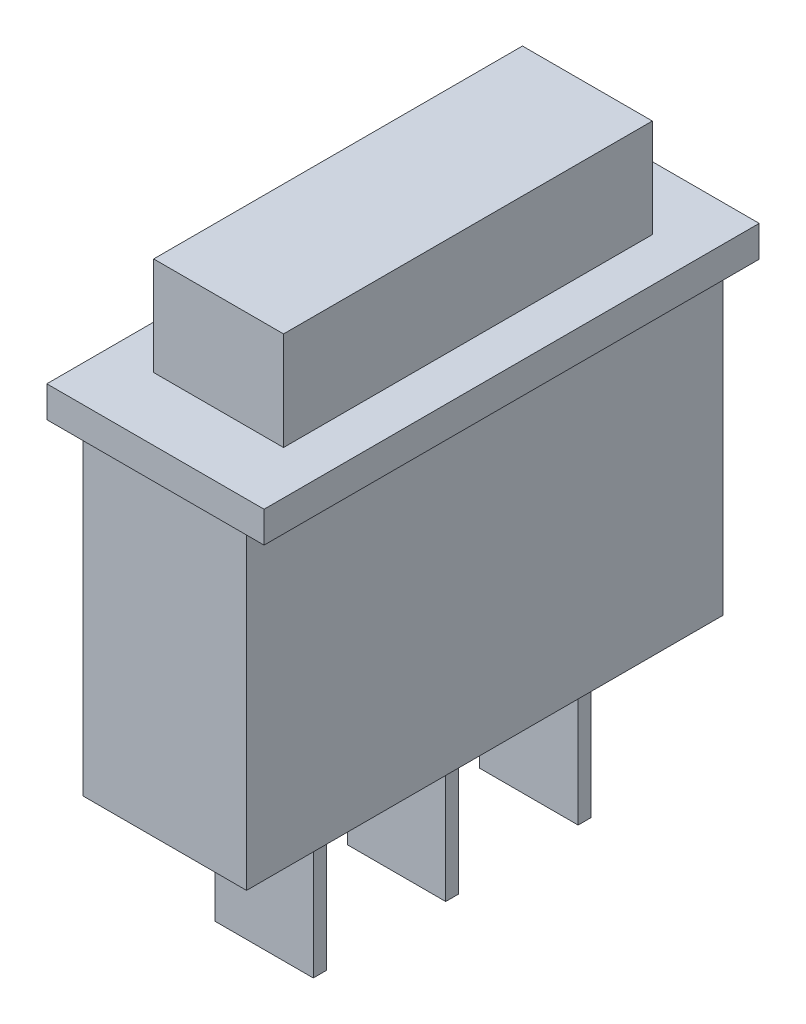
ISO-10303-21;
HEADER;
FILE_DESCRIPTION(('STEP AP214'),'2;1');
FILE_NAME('part.step','',(''),(''),'','','');
FILE_SCHEMA(('AUTOMOTIVE_DESIGN { 1 0 10303 214 1 1 1 1 }'));
ENDSEC;
DATA;
#1=APPLICATION_CONTEXT('core data for automotive mechanical design processes');
#2=APPLICATION_PROTOCOL_DEFINITION('international standard','automotive_design',2000,#1);
#3=PRODUCT_CONTEXT('',#1,'mechanical');
#4=PRODUCT('Part','Part','',(#3));
#5=PRODUCT_RELATED_PRODUCT_CATEGORY('part','',(#4));
#6=PRODUCT_DEFINITION_FORMATION('','',#4);
#7=PRODUCT_DEFINITION_CONTEXT('part definition',#1,'design');
#8=PRODUCT_DEFINITION('design','',#6,#7);
#9=PRODUCT_DEFINITION_SHAPE('','',#8);
#10=(LENGTH_UNIT() NAMED_UNIT(*) SI_UNIT(.MILLI.,.METRE.));
#11=(NAMED_UNIT(*) PLANE_ANGLE_UNIT() SI_UNIT($,.RADIAN.));
#12=(NAMED_UNIT(*) SI_UNIT($,.STERADIAN.) SOLID_ANGLE_UNIT());
#13=UNCERTAINTY_MEASURE_WITH_UNIT(LENGTH_MEASURE(1.E-05),#10,'distance_accuracy_value','');
#14=(GEOMETRIC_REPRESENTATION_CONTEXT(3) GLOBAL_UNCERTAINTY_ASSIGNED_CONTEXT((#13)) GLOBAL_UNIT_ASSIGNED_CONTEXT((#10,
#11,#12)) REPRESENTATION_CONTEXT('',''));
#15=CARTESIAN_POINT('',(0.,0.,0.));
#16=DIRECTION('',(0.,0.,1.));
#17=DIRECTION('',(1.,0.,0.));
#18=AXIS2_PLACEMENT_3D('',#15,#16,#17);
#19=CARTESIAN_POINT('',(0.,0.,0.));
#20=DIRECTION('',(0.,-1.,0.));
#21=DIRECTION('',(0.,0.,-1.));
#22=AXIS2_PLACEMENT_3D('',#19,#20,#21);
#23=PLANE('',#22);
#24=DIRECTION('',(0.,0.,1.));
#25=VECTOR('',#24,1.);
#26=CARTESIAN_POINT('',(0.,0.,0.));
#27=LINE('',#26,#25);
#28=CARTESIAN_POINT('',(0.,0.,-30.734));
#29=VERTEX_POINT('',#28);
#30=CARTESIAN_POINT('',(0.,0.,0.));
#31=VERTEX_POINT('',#30);
#32=EDGE_CURVE('E341',#29,#31,#27,.T.);
#33=ORIENTED_EDGE('',*,*,#32,.F.);
#34=DIRECTION('',(-1.,0.,0.));
#35=VECTOR('',#34,1.);
#36=CARTESIAN_POINT('',(0.,0.,-30.734));
#37=LINE('',#36,#35);
#38=CARTESIAN_POINT('',(10.541,0.,-30.734));
#39=VERTEX_POINT('',#38);
#40=EDGE_CURVE('E346',#39,#29,#37,.T.);
#41=ORIENTED_EDGE('',*,*,#40,.F.);
#42=DIRECTION('',(0.,0.,-1.));
#43=VECTOR('',#42,1.);
#44=CARTESIAN_POINT('',(10.541,0.,0.));
#45=LINE('',#44,#43);
#46=CARTESIAN_POINT('',(10.541,0.,0.));
#47=VERTEX_POINT('',#46);
#48=EDGE_CURVE('E360',#47,#39,#45,.T.);
#49=ORIENTED_EDGE('',*,*,#48,.F.);
#50=DIRECTION('',(1.,0.,0.));
#51=VECTOR('',#50,1.);
#52=CARTESIAN_POINT('',(0.,0.,0.));
#53=LINE('',#52,#51);
#54=EDGE_CURVE('E358',#31,#47,#53,.T.);
#55=ORIENTED_EDGE('',*,*,#54,.F.);
#56=EDGE_LOOP('',(#33,#41,#49,#55));
#57=FACE_BOUND('',#56,.T.);
#58=DIRECTION('',(1.,0.,0.));
#59=VECTOR('',#58,1.);
#60=CARTESIAN_POINT('',(8.44550000000001,0.,-24.3323307977406));
#61=LINE('',#60,#59);
#62=CARTESIAN_POINT('',(2.09550000000001,0.,-24.3323307977406));
#63=VERTEX_POINT('',#62);
#64=CARTESIAN_POINT('',(8.44550000000001,0.,-24.3323307977406));
#65=VERTEX_POINT('',#64);
#66=EDGE_CURVE('E267',#63,#65,#61,.T.);
#67=ORIENTED_EDGE('',*,*,#66,.F.);
#68=DIRECTION('',(0.,0.,-1.));
#69=VECTOR('',#68,1.);
#70=CARTESIAN_POINT('',(2.09550000000001,0.,-23.4941307977406));
#71=LINE('',#70,#69);
#72=CARTESIAN_POINT('',(2.09550000000001,0.,-23.4941307977406));
#73=VERTEX_POINT('',#72);
#74=EDGE_CURVE('E253',#73,#63,#71,.T.);
#75=ORIENTED_EDGE('',*,*,#74,.F.);
#76=DIRECTION('',(-1.,0.,0.));
#77=VECTOR('',#76,1.);
#78=CARTESIAN_POINT('',(8.44550000000001,0.,-23.4941307977406));
#79=LINE('',#78,#77);
#80=CARTESIAN_POINT('',(8.44550000000001,0.,-23.4941307977406));
#81=VERTEX_POINT('',#80);
#82=EDGE_CURVE('E258',#81,#73,#79,.T.);
#83=ORIENTED_EDGE('',*,*,#82,.F.);
#84=DIRECTION('',(0.,0.,1.));
#85=VECTOR('',#84,1.);
#86=CARTESIAN_POINT('',(8.44550000000001,0.,-23.4941307977406));
#87=LINE('',#86,#85);
#88=EDGE_CURVE('E269',#65,#81,#87,.T.);
#89=ORIENTED_EDGE('',*,*,#88,.F.);
#90=EDGE_LOOP('',(#67,#75,#83,#89));
#91=FACE_BOUND('',#90,.T.);
#92=DIRECTION('',(-1.,0.,0.));
#93=VECTOR('',#92,1.);
#94=CARTESIAN_POINT('',(2.0955,0.,-14.9479));
#95=LINE('',#94,#93);
#96=CARTESIAN_POINT('',(8.4455,0.,-14.9479));
#97=VERTEX_POINT('',#96);
#98=CARTESIAN_POINT('',(2.0955,0.,-14.9479));
#99=VERTEX_POINT('',#98);
#100=EDGE_CURVE('E225',#97,#99,#95,.T.);
#101=ORIENTED_EDGE('',*,*,#100,.F.);
#102=DIRECTION('',(0.,0.,1.));
#103=VECTOR('',#102,1.);
#104=CARTESIAN_POINT('',(8.4455,0.,-15.7861));
#105=LINE('',#104,#103);
#106=CARTESIAN_POINT('',(8.4455,0.,-15.7861));
#107=VERTEX_POINT('',#106);
#108=EDGE_CURVE('E222',#107,#97,#105,.T.);
#109=ORIENTED_EDGE('',*,*,#108,.F.);
#110=DIRECTION('',(1.,0.,0.));
#111=VECTOR('',#110,1.);
#112=CARTESIAN_POINT('',(2.0955,0.,-15.7861));
#113=LINE('',#112,#111);
#114=CARTESIAN_POINT('',(2.0955,0.,-15.7861));
#115=VERTEX_POINT('',#114);
#116=EDGE_CURVE('E234',#115,#107,#113,.T.);
#117=ORIENTED_EDGE('',*,*,#116,.F.);
#118=DIRECTION('',(0.,0.,-1.));
#119=VECTOR('',#118,1.);
#120=CARTESIAN_POINT('',(2.0955,0.,-15.7861));
#121=LINE('',#120,#119);
#122=EDGE_CURVE('E242',#99,#115,#121,.T.);
#123=ORIENTED_EDGE('',*,*,#122,.F.);
#124=EDGE_LOOP('',(#101,#109,#117,#123));
#125=FACE_BOUND('',#124,.T.);
#126=DIRECTION('',(-1.,0.,0.));
#127=VECTOR('',#126,1.);
#128=CARTESIAN_POINT('',(8.44550000000001,0.,-6.40166920225935));
#129=LINE('',#128,#127);
#130=CARTESIAN_POINT('',(8.44550000000001,0.,-6.40166920225935));
#131=VERTEX_POINT('',#130);
#132=CARTESIAN_POINT('',(2.09550000000001,0.,-6.40166920225935));
#133=VERTEX_POINT('',#132);
#134=EDGE_CURVE('E651',#131,#133,#129,.T.);
#135=ORIENTED_EDGE('',*,*,#134,.F.);
#136=DIRECTION('',(0.,0.,1.));
#137=VECTOR('',#136,1.);
#138=CARTESIAN_POINT('',(8.44550000000001,0.,-7.23986920225935));
#139=LINE('',#138,#137);
#140=CARTESIAN_POINT('',(8.44550000000001,0.,-7.23986920225935));
#141=VERTEX_POINT('',#140);
#142=EDGE_CURVE('E220',#141,#131,#139,.T.);
#143=ORIENTED_EDGE('',*,*,#142,.F.);
#144=DIRECTION('',(1.,0.,0.));
#145=VECTOR('',#144,1.);
#146=CARTESIAN_POINT('',(8.44550000000001,0.,-7.23986920225935));
#147=LINE('',#146,#145);
#148=CARTESIAN_POINT('',(2.09550000000001,0.,-7.23986920225935));
#149=VERTEX_POINT('',#148);
#150=EDGE_CURVE('E216',#149,#141,#147,.T.);
#151=ORIENTED_EDGE('',*,*,#150,.F.);
#152=DIRECTION('',(0.,0.,-1.));
#153=VECTOR('',#152,1.);
#154=CARTESIAN_POINT('',(2.09550000000001,0.,-7.23986920225935));
#155=LINE('',#154,#153);
#156=EDGE_CURVE('E648',#133,#149,#155,.T.);
#157=ORIENTED_EDGE('',*,*,#156,.F.);
#158=EDGE_LOOP('',(#135,#143,#151,#157));
#159=FACE_BOUND('',#158,.T.);
#160=ADVANCED_FACE('F35',(#57,#91,#125,#159),#23,.T.);
#161=CARTESIAN_POINT('',(0.,22.479,0.));
#162=DIRECTION('',(0.,1.,0.));
#163=DIRECTION('',(0.,0.,1.));
#164=AXIS2_PLACEMENT_3D('',#161,#162,#163);
#165=PLANE('',#164);
#166=DIRECTION('',(0.,0.,1.));
#167=VECTOR('',#166,1.);
#168=CARTESIAN_POINT('',(-1.7399,22.479,0.609600000000004));
#169=LINE('',#168,#167);
#170=CARTESIAN_POINT('',(-1.7399,22.479,-31.3436));
#171=VERTEX_POINT('',#170);
#172=CARTESIAN_POINT('',(-1.7399,22.479,0.609600000000004));
#173=VERTEX_POINT('',#172);
#174=EDGE_CURVE('E312',#171,#173,#169,.T.);
#175=ORIENTED_EDGE('',*,*,#174,.T.);
#176=DIRECTION('',(1.,0.,0.));
#177=VECTOR('',#176,1.);
#178=CARTESIAN_POINT('',(12.2809,22.479,0.609600000000002));
#179=LINE('',#178,#177);
#180=CARTESIAN_POINT('',(12.2809,22.479,0.609600000000002));
#181=VERTEX_POINT('',#180);
#182=EDGE_CURVE('E315',#173,#181,#179,.T.);
#183=ORIENTED_EDGE('',*,*,#182,.T.);
#184=DIRECTION('',(0.,0.,-1.));
#185=VECTOR('',#184,1.);
#186=CARTESIAN_POINT('',(12.2809,22.479,0.609600000000002));
#187=LINE('',#186,#185);
#188=CARTESIAN_POINT('',(12.2809,22.479,-31.3436));
#189=VERTEX_POINT('',#188);
#190=EDGE_CURVE('E318',#181,#189,#187,.T.);
#191=ORIENTED_EDGE('',*,*,#190,.T.);
#192=DIRECTION('',(-1.,0.,0.));
#193=VECTOR('',#192,1.);
#194=CARTESIAN_POINT('',(12.2809,22.479,-31.3436));
#195=LINE('',#194,#193);
#196=EDGE_CURVE('E320',#189,#171,#195,.T.);
#197=ORIENTED_EDGE('',*,*,#196,.T.);
#198=EDGE_LOOP('',(#175,#183,#191,#197));
#199=FACE_BOUND('',#198,.T.);
#200=DIRECTION('',(1.,0.,0.));
#201=VECTOR('',#200,1.);
#202=CARTESIAN_POINT('',(9.4615,22.479,-3.4671));
#203=LINE('',#202,#201);
#204=CARTESIAN_POINT('',(1.0795,22.479,-3.4671));
#205=VERTEX_POINT('',#204);
#206=CARTESIAN_POINT('',(9.4615,22.479,-3.4671));
#207=VERTEX_POINT('',#206);
#208=EDGE_CURVE('E296',#205,#207,#203,.T.);
#209=ORIENTED_EDGE('',*,*,#208,.F.);
#210=DIRECTION('',(0.,0.,1.));
#211=VECTOR('',#210,1.);
#212=CARTESIAN_POINT('',(1.0795,22.479,-3.4671));
#213=LINE('',#212,#211);
#214=CARTESIAN_POINT('',(1.0795,22.479,-27.2669));
#215=VERTEX_POINT('',#214);
#216=EDGE_CURVE('E282',#215,#205,#213,.T.);
#217=ORIENTED_EDGE('',*,*,#216,.F.);
#218=DIRECTION('',(-1.,0.,0.));
#219=VECTOR('',#218,1.);
#220=CARTESIAN_POINT('',(9.4615,22.479,-27.2669));
#221=LINE('',#220,#219);
#222=CARTESIAN_POINT('',(9.4615,22.479,-27.2669));
#223=VERTEX_POINT('',#222);
#224=EDGE_CURVE('E287',#223,#215,#221,.T.);
#225=ORIENTED_EDGE('',*,*,#224,.F.);
#226=DIRECTION('',(0.,0.,-1.));
#227=VECTOR('',#226,1.);
#228=CARTESIAN_POINT('',(9.4615,22.479,-3.4671));
#229=LINE('',#228,#227);
#230=EDGE_CURVE('E298',#207,#223,#229,.T.);
#231=ORIENTED_EDGE('',*,*,#230,.F.);
#232=EDGE_LOOP('',(#209,#217,#225,#231));
#233=FACE_BOUND('',#232,.T.);
#234=ADVANCED_FACE('F392',(#199,#233),#165,.T.);
#235=CARTESIAN_POINT('',(0.,20.4724,0.));
#236=DIRECTION('',(1.,0.,0.));
#237=DIRECTION('',(0.,0.,-1.));
#238=AXIS2_PLACEMENT_3D('',#235,#236,#237);
#239=PLANE('',#238);
#240=ORIENTED_EDGE('',*,*,#32,.T.);
#241=DIRECTION('',(0.,-1.,0.));
#242=VECTOR('',#241,1.);
#243=CARTESIAN_POINT('',(0.,20.4724,0.));
#244=LINE('',#243,#242);
#245=CARTESIAN_POINT('',(0.,20.4724,0.));
#246=VERTEX_POINT('',#245);
#247=EDGE_CURVE('E11',#246,#31,#244,.T.);
#248=ORIENTED_EDGE('',*,*,#247,.F.);
#249=DIRECTION('',(0.,0.,1.));
#250=VECTOR('',#249,1.);
#251=CARTESIAN_POINT('',(0.,20.4724,0.));
#252=LINE('',#251,#250);
#253=CARTESIAN_POINT('',(0.,20.4724,-30.734));
#254=VERTEX_POINT('',#253);
#255=EDGE_CURVE('E342',#254,#246,#252,.T.);
#256=ORIENTED_EDGE('',*,*,#255,.F.);
#257=DIRECTION('',(0.,-1.,0.));
#258=VECTOR('',#257,1.);
#259=CARTESIAN_POINT('',(0.,20.4724,-30.734));
#260=LINE('',#259,#258);
#261=EDGE_CURVE('E355',#254,#29,#260,.T.);
#262=ORIENTED_EDGE('',*,*,#261,.T.);
#263=EDGE_LOOP('',(#240,#248,#256,#262));
#264=FACE_BOUND('',#263,.T.);
#265=ADVANCED_FACE('F37',(#264),#239,.F.);
#266=CARTESIAN_POINT('',(0.,20.4724,0.));
#267=DIRECTION('',(0.,0.,-1.));
#268=DIRECTION('',(-1.,0.,0.));
#269=AXIS2_PLACEMENT_3D('',#266,#267,#268);
#270=PLANE('',#269);
#271=ORIENTED_EDGE('',*,*,#54,.T.);
#272=DIRECTION('',(0.,-1.,0.));
#273=VECTOR('',#272,1.);
#274=CARTESIAN_POINT('',(10.541,20.4724,0.));
#275=LINE('',#274,#273);
#276=CARTESIAN_POINT('',(10.541,20.4724,0.));
#277=VERTEX_POINT('',#276);
#278=EDGE_CURVE('E43',#277,#47,#275,.T.);
#279=ORIENTED_EDGE('',*,*,#278,.F.);
#280=DIRECTION('',(1.,0.,0.));
#281=VECTOR('',#280,1.);
#282=CARTESIAN_POINT('',(0.,20.4724,0.));
#283=LINE('',#282,#281);
#284=EDGE_CURVE('E345',#246,#277,#283,.T.);
#285=ORIENTED_EDGE('',*,*,#284,.F.);
#286=ORIENTED_EDGE('',*,*,#247,.T.);
#287=EDGE_LOOP('',(#271,#279,#285,#286));
#288=FACE_BOUND('',#287,.T.);
#289=ADVANCED_FACE('F385',(#288),#270,.F.);
#290=CARTESIAN_POINT('',(10.541,20.4724,0.));
#291=DIRECTION('',(-1.,0.,0.));
#292=DIRECTION('',(0.,0.,1.));
#293=AXIS2_PLACEMENT_3D('',#290,#291,#292);
#294=PLANE('',#293);
#295=ORIENTED_EDGE('',*,*,#48,.T.);
#296=DIRECTION('',(0.,-1.,0.));
#297=VECTOR('',#296,1.);
#298=CARTESIAN_POINT('',(10.541,20.4724,-30.734));
#299=LINE('',#298,#297);
#300=CARTESIAN_POINT('',(10.541,20.4724,-30.734));
#301=VERTEX_POINT('',#300);
#302=EDGE_CURVE('E365',#301,#39,#299,.T.);
#303=ORIENTED_EDGE('',*,*,#302,.F.);
#304=DIRECTION('',(0.,0.,-1.));
#305=VECTOR('',#304,1.);
#306=CARTESIAN_POINT('',(10.541,20.4724,0.));
#307=LINE('',#306,#305);
#308=EDGE_CURVE('E349',#277,#301,#307,.T.);
#309=ORIENTED_EDGE('',*,*,#308,.F.);
#310=ORIENTED_EDGE('',*,*,#278,.T.);
#311=EDGE_LOOP('',(#295,#303,#309,#310));
#312=FACE_BOUND('',#311,.T.);
#313=ADVANCED_FACE('F371',(#312),#294,.F.);
#314=CARTESIAN_POINT('',(0.,20.4724,-30.734));
#315=DIRECTION('',(0.,0.,1.));
#316=DIRECTION('',(1.,0.,0.));
#317=AXIS2_PLACEMENT_3D('',#314,#315,#316);
#318=PLANE('',#317);
#319=ORIENTED_EDGE('',*,*,#40,.T.);
#320=ORIENTED_EDGE('',*,*,#261,.F.);
#321=DIRECTION('',(-1.,0.,0.));
#322=VECTOR('',#321,1.);
#323=CARTESIAN_POINT('',(0.,20.4724,-30.734));
#324=LINE('',#323,#322);
#325=EDGE_CURVE('E352',#301,#254,#324,.T.);
#326=ORIENTED_EDGE('',*,*,#325,.F.);
#327=ORIENTED_EDGE('',*,*,#302,.T.);
#328=EDGE_LOOP('',(#319,#320,#326,#327));
#329=FACE_BOUND('',#328,.T.);
#330=ADVANCED_FACE('F379',(#329),#318,.F.);
#331=CARTESIAN_POINT('',(0.,20.4724,0.));
#332=DIRECTION('',(0.,1.,0.));
#333=DIRECTION('',(0.,0.,1.));
#334=AXIS2_PLACEMENT_3D('',#331,#332,#333);
#335=PLANE('',#334);
#336=DIRECTION('',(0.,0.,1.));
#337=VECTOR('',#336,1.);
#338=CARTESIAN_POINT('',(-1.7399,20.4724,0.609600000000004));
#339=LINE('',#338,#337);
#340=CARTESIAN_POINT('',(-1.7399,20.4724,-31.3436));
#341=VERTEX_POINT('',#340);
#342=CARTESIAN_POINT('',(-1.7399,20.4724,0.609600000000004));
#343=VERTEX_POINT('',#342);
#344=EDGE_CURVE('E311',#341,#343,#339,.T.);
#345=ORIENTED_EDGE('',*,*,#344,.F.);
#346=DIRECTION('',(-1.,0.,0.));
#347=VECTOR('',#346,1.);
#348=CARTESIAN_POINT('',(12.2809,20.4724,-31.3436));
#349=LINE('',#348,#347);
#350=CARTESIAN_POINT('',(12.2809,20.4724,-31.3436));
#351=VERTEX_POINT('',#350);
#352=EDGE_CURVE('E316',#351,#341,#349,.T.);
#353=ORIENTED_EDGE('',*,*,#352,.F.);
#354=DIRECTION('',(0.,0.,-1.));
#355=VECTOR('',#354,1.);
#356=CARTESIAN_POINT('',(12.2809,20.4724,0.609600000000002));
#357=LINE('',#356,#355);
#358=CARTESIAN_POINT('',(12.2809,20.4724,0.609600000000002));
#359=VERTEX_POINT('',#358);
#360=EDGE_CURVE('E327',#359,#351,#357,.T.);
#361=ORIENTED_EDGE('',*,*,#360,.F.);
#362=DIRECTION('',(1.,0.,0.));
#363=VECTOR('',#362,1.);
#364=CARTESIAN_POINT('',(12.2809,20.4724,0.609600000000002));
#365=LINE('',#364,#363);
#366=EDGE_CURVE('E325',#343,#359,#365,.T.);
#367=ORIENTED_EDGE('',*,*,#366,.F.);
#368=EDGE_LOOP('',(#345,#353,#361,#367));
#369=FACE_BOUND('',#368,.T.);
#370=ORIENTED_EDGE('',*,*,#325,.T.);
#371=ORIENTED_EDGE('',*,*,#255,.T.);
#372=ORIENTED_EDGE('',*,*,#284,.T.);
#373=ORIENTED_EDGE('',*,*,#308,.T.);
#374=EDGE_LOOP('',(#370,#371,#372,#373));
#375=FACE_BOUND('',#374,.T.);
#376=ADVANCED_FACE('F384',(#369,#375),#335,.F.);
#377=CARTESIAN_POINT('',(-1.7399,22.479,0.609600000000004));
#378=DIRECTION('',(1.,0.,0.));
#379=DIRECTION('',(0.,0.,-1.));
#380=AXIS2_PLACEMENT_3D('',#377,#378,#379);
#381=PLANE('',#380);
#382=ORIENTED_EDGE('',*,*,#344,.T.);
#383=DIRECTION('',(0.,-1.,0.));
#384=VECTOR('',#383,1.);
#385=CARTESIAN_POINT('',(-1.7399,22.479,0.609600000000004));
#386=LINE('',#385,#384);
#387=EDGE_CURVE('E338',#173,#343,#386,.T.);
#388=ORIENTED_EDGE('',*,*,#387,.F.);
#389=ORIENTED_EDGE('',*,*,#174,.F.);
#390=DIRECTION('',(0.,-1.,0.));
#391=VECTOR('',#390,1.);
#392=CARTESIAN_POINT('',(-1.7399,22.479,-31.3436));
#393=LINE('',#392,#391);
#394=EDGE_CURVE('E322',#171,#341,#393,.T.);
#395=ORIENTED_EDGE('',*,*,#394,.T.);
#396=EDGE_LOOP('',(#382,#388,#389,#395));
#397=FACE_BOUND('',#396,.T.);
#398=ADVANCED_FACE('F402',(#397),#381,.F.);
#399=CARTESIAN_POINT('',(12.2809,22.479,0.609600000000002));
#400=DIRECTION('',(0.,0.,-1.));
#401=DIRECTION('',(-1.,0.,0.));
#402=AXIS2_PLACEMENT_3D('',#399,#400,#401);
#403=PLANE('',#402);
#404=ORIENTED_EDGE('',*,*,#366,.T.);
#405=DIRECTION('',(0.,-1.,0.));
#406=VECTOR('',#405,1.);
#407=CARTESIAN_POINT('',(12.2809,22.479,0.609600000000002));
#408=LINE('',#407,#406);
#409=EDGE_CURVE('E335',#181,#359,#408,.T.);
#410=ORIENTED_EDGE('',*,*,#409,.F.);
#411=ORIENTED_EDGE('',*,*,#182,.F.);
#412=ORIENTED_EDGE('',*,*,#387,.T.);
#413=EDGE_LOOP('',(#404,#410,#411,#412));
#414=FACE_BOUND('',#413,.T.);
#415=ADVANCED_FACE('F413',(#414),#403,.F.);
#416=CARTESIAN_POINT('',(12.2809,22.479,0.609600000000002));
#417=DIRECTION('',(-1.,0.,0.));
#418=DIRECTION('',(0.,0.,1.));
#419=AXIS2_PLACEMENT_3D('',#416,#417,#418);
#420=PLANE('',#419);
#421=ORIENTED_EDGE('',*,*,#360,.T.);
#422=DIRECTION('',(0.,-1.,0.));
#423=VECTOR('',#422,1.);
#424=CARTESIAN_POINT('',(12.2809,22.479,-31.3436));
#425=LINE('',#424,#423);
#426=EDGE_CURVE('E332',#189,#351,#425,.T.);
#427=ORIENTED_EDGE('',*,*,#426,.F.);
#428=ORIENTED_EDGE('',*,*,#190,.F.);
#429=ORIENTED_EDGE('',*,*,#409,.T.);
#430=EDGE_LOOP('',(#421,#427,#428,#429));
#431=FACE_BOUND('',#430,.T.);
#432=ADVANCED_FACE('F422',(#431),#420,.F.);
#433=CARTESIAN_POINT('',(12.2809,22.479,-31.3436));
#434=DIRECTION('',(0.,0.,1.));
#435=DIRECTION('',(1.,0.,0.));
#436=AXIS2_PLACEMENT_3D('',#433,#434,#435);
#437=PLANE('',#436);
#438=ORIENTED_EDGE('',*,*,#352,.T.);
#439=ORIENTED_EDGE('',*,*,#394,.F.);
#440=ORIENTED_EDGE('',*,*,#196,.F.);
#441=ORIENTED_EDGE('',*,*,#426,.T.);
#442=EDGE_LOOP('',(#438,#439,#440,#441));
#443=FACE_BOUND('',#442,.T.);
#444=ADVANCED_FACE('F418',(#443),#437,.F.);
#445=CARTESIAN_POINT('',(1.0795,28.829,-3.4671));
#446=DIRECTION('',(1.,0.,0.));
#447=DIRECTION('',(0.,0.,-1.));
#448=AXIS2_PLACEMENT_3D('',#445,#446,#447);
#449=PLANE('',#448);
#450=ORIENTED_EDGE('',*,*,#216,.T.);
#451=DIRECTION('',(0.,-1.,0.));
#452=VECTOR('',#451,1.);
#453=CARTESIAN_POINT('',(1.0795,28.829,-3.4671));
#454=LINE('',#453,#452);
#455=CARTESIAN_POINT('',(1.0795,28.829,-3.4671));
#456=VERTEX_POINT('',#455);
#457=EDGE_CURVE('E309',#456,#205,#454,.T.);
#458=ORIENTED_EDGE('',*,*,#457,.F.);
#459=DIRECTION('',(0.,0.,1.));
#460=VECTOR('',#459,1.);
#461=CARTESIAN_POINT('',(1.0795,28.829,-3.4671));
#462=LINE('',#461,#460);
#463=CARTESIAN_POINT('',(1.0795,28.829,-27.2669));
#464=VERTEX_POINT('',#463);
#465=EDGE_CURVE('E283',#464,#456,#462,.T.);
#466=ORIENTED_EDGE('',*,*,#465,.F.);
#467=DIRECTION('',(0.,-1.,0.));
#468=VECTOR('',#467,1.);
#469=CARTESIAN_POINT('',(1.0795,28.829,-27.2669));
#470=LINE('',#469,#468);
#471=EDGE_CURVE('E293',#464,#215,#470,.T.);
#472=ORIENTED_EDGE('',*,*,#471,.T.);
#473=EDGE_LOOP('',(#450,#458,#466,#472));
#474=FACE_BOUND('',#473,.T.);
#475=ADVANCED_FACE('F421',(#474),#449,.F.);
#476=CARTESIAN_POINT('',(9.4615,28.829,-3.4671));
#477=DIRECTION('',(0.,0.,-1.));
#478=DIRECTION('',(-1.,0.,0.));
#479=AXIS2_PLACEMENT_3D('',#476,#477,#478);
#480=PLANE('',#479);
#481=ORIENTED_EDGE('',*,*,#208,.T.);
#482=DIRECTION('',(0.,-1.,0.));
#483=VECTOR('',#482,1.);
#484=CARTESIAN_POINT('',(9.4615,28.829,-3.4671));
#485=LINE('',#484,#483);
#486=CARTESIAN_POINT('',(9.4615,28.829,-3.4671));
#487=VERTEX_POINT('',#486);
#488=EDGE_CURVE('E306',#487,#207,#485,.T.);
#489=ORIENTED_EDGE('',*,*,#488,.F.);
#490=DIRECTION('',(1.,0.,0.));
#491=VECTOR('',#490,1.);
#492=CARTESIAN_POINT('',(9.4615,28.829,-3.4671));
#493=LINE('',#492,#491);
#494=EDGE_CURVE('E286',#456,#487,#493,.T.);
#495=ORIENTED_EDGE('',*,*,#494,.F.);
#496=ORIENTED_EDGE('',*,*,#457,.T.);
#497=EDGE_LOOP('',(#481,#489,#495,#496));
#498=FACE_BOUND('',#497,.T.);
#499=ADVANCED_FACE('F446',(#498),#480,.F.);
#500=CARTESIAN_POINT('',(9.4615,28.829,-3.4671));
#501=DIRECTION('',(-1.,0.,0.));
#502=DIRECTION('',(0.,0.,1.));
#503=AXIS2_PLACEMENT_3D('',#500,#501,#502);
#504=PLANE('',#503);
#505=ORIENTED_EDGE('',*,*,#230,.T.);
#506=DIRECTION('',(0.,-1.,0.));
#507=VECTOR('',#506,1.);
#508=CARTESIAN_POINT('',(9.4615,28.829,-27.2669));
#509=LINE('',#508,#507);
#510=CARTESIAN_POINT('',(9.4615,28.829,-27.2669));
#511=VERTEX_POINT('',#510);
#512=EDGE_CURVE('E304',#511,#223,#509,.T.);
#513=ORIENTED_EDGE('',*,*,#512,.F.);
#514=DIRECTION('',(0.,0.,-1.));
#515=VECTOR('',#514,1.);
#516=CARTESIAN_POINT('',(9.4615,28.829,-3.4671));
#517=LINE('',#516,#515);
#518=EDGE_CURVE('E289',#487,#511,#517,.T.);
#519=ORIENTED_EDGE('',*,*,#518,.F.);
#520=ORIENTED_EDGE('',*,*,#488,.T.);
#521=EDGE_LOOP('',(#505,#513,#519,#520));
#522=FACE_BOUND('',#521,.T.);
#523=ADVANCED_FACE('F450',(#522),#504,.F.);
#524=CARTESIAN_POINT('',(9.4615,28.829,-27.2669));
#525=DIRECTION('',(0.,0.,1.));
#526=DIRECTION('',(1.,0.,0.));
#527=AXIS2_PLACEMENT_3D('',#524,#525,#526);
#528=PLANE('',#527);
#529=ORIENTED_EDGE('',*,*,#224,.T.);
#530=ORIENTED_EDGE('',*,*,#471,.F.);
#531=DIRECTION('',(-1.,0.,0.));
#532=VECTOR('',#531,1.);
#533=CARTESIAN_POINT('',(9.4615,28.829,-27.2669));
#534=LINE('',#533,#532);
#535=EDGE_CURVE('E291',#511,#464,#534,.T.);
#536=ORIENTED_EDGE('',*,*,#535,.F.);
#537=ORIENTED_EDGE('',*,*,#512,.T.);
#538=EDGE_LOOP('',(#529,#530,#536,#537));
#539=FACE_BOUND('',#538,.T.);
#540=ADVANCED_FACE('F459',(#539),#528,.F.);
#541=CARTESIAN_POINT('',(0.,28.829,0.));
#542=DIRECTION('',(0.,1.,0.));
#543=DIRECTION('',(0.,0.,1.));
#544=AXIS2_PLACEMENT_3D('',#541,#542,#543);
#545=PLANE('',#544);
#546=ORIENTED_EDGE('',*,*,#465,.T.);
#547=ORIENTED_EDGE('',*,*,#494,.T.);
#548=ORIENTED_EDGE('',*,*,#518,.T.);
#549=ORIENTED_EDGE('',*,*,#535,.T.);
#550=EDGE_LOOP('',(#546,#547,#548,#549));
#551=FACE_BOUND('',#550,.T.);
#552=ADVANCED_FACE('F454',(#551),#545,.T.);
#553=CARTESIAN_POINT('',(2.09550000000001,-9.144,-23.4941307977406));
#554=DIRECTION('',(1.,0.,0.));
#555=DIRECTION('',(0.,0.,-1.));
#556=AXIS2_PLACEMENT_3D('',#553,#554,#555);
#557=PLANE('',#556);
#558=ORIENTED_EDGE('',*,*,#74,.T.);
#559=DIRECTION('',(0.,1.,0.));
#560=VECTOR('',#559,1.);
#561=CARTESIAN_POINT('',(2.09550000000001,-9.144,-24.3323307977406));
#562=LINE('',#561,#560);
#563=CARTESIAN_POINT('',(2.09550000000001,-9.144,-24.3323307977406));
#564=VERTEX_POINT('',#563);
#565=EDGE_CURVE('E280',#564,#63,#562,.T.);
#566=ORIENTED_EDGE('',*,*,#565,.F.);
#567=DIRECTION('',(0.,0.,-1.));
#568=VECTOR('',#567,1.);
#569=CARTESIAN_POINT('',(2.09550000000001,-9.144,-23.4941307977406));
#570=LINE('',#569,#568);
#571=CARTESIAN_POINT('',(2.09550000000001,-9.144,-23.4941307977406));
#572=VERTEX_POINT('',#571);
#573=EDGE_CURVE('E254',#572,#564,#570,.T.);
#574=ORIENTED_EDGE('',*,*,#573,.F.);
#575=DIRECTION('',(0.,1.,0.));
#576=VECTOR('',#575,1.);
#577=CARTESIAN_POINT('',(2.09550000000001,-9.144,-23.4941307977406));
#578=LINE('',#577,#576);
#579=EDGE_CURVE('E264',#572,#73,#578,.T.);
#580=ORIENTED_EDGE('',*,*,#579,.T.);
#581=EDGE_LOOP('',(#558,#566,#574,#580));
#582=FACE_BOUND('',#581,.T.);
#583=ADVANCED_FACE('F466',(#582),#557,.F.);
#584=CARTESIAN_POINT('',(8.44550000000001,-9.144,-24.3323307977406));
#585=DIRECTION('',(0.,0.,1.));
#586=DIRECTION('',(1.,0.,0.));
#587=AXIS2_PLACEMENT_3D('',#584,#585,#586);
#588=PLANE('',#587);
#589=ORIENTED_EDGE('',*,*,#66,.T.);
#590=DIRECTION('',(0.,1.,0.));
#591=VECTOR('',#590,1.);
#592=CARTESIAN_POINT('',(8.44550000000001,-9.144,-24.3323307977406));
#593=LINE('',#592,#591);
#594=CARTESIAN_POINT('',(8.44550000000001,-9.144,-24.3323307977406));
#595=VERTEX_POINT('',#594);
#596=EDGE_CURVE('E277',#595,#65,#593,.T.);
#597=ORIENTED_EDGE('',*,*,#596,.F.);
#598=DIRECTION('',(1.,0.,0.));
#599=VECTOR('',#598,1.);
#600=CARTESIAN_POINT('',(8.44550000000001,-9.144,-24.3323307977406));
#601=LINE('',#600,#599);
#602=EDGE_CURVE('E257',#564,#595,#601,.T.);
#603=ORIENTED_EDGE('',*,*,#602,.F.);
#604=ORIENTED_EDGE('',*,*,#565,.T.);
#605=EDGE_LOOP('',(#589,#597,#603,#604));
#606=FACE_BOUND('',#605,.T.);
#607=ADVANCED_FACE('F509',(#606),#588,.F.);
#608=CARTESIAN_POINT('',(8.44550000000001,-9.144,-23.4941307977406));
#609=DIRECTION('',(-1.,0.,0.));
#610=DIRECTION('',(0.,0.,1.));
#611=AXIS2_PLACEMENT_3D('',#608,#609,#610);
#612=PLANE('',#611);
#613=ORIENTED_EDGE('',*,*,#88,.T.);
#614=DIRECTION('',(0.,1.,0.));
#615=VECTOR('',#614,1.);
#616=CARTESIAN_POINT('',(8.44550000000001,-9.144,-23.4941307977406));
#617=LINE('',#616,#615);
#618=CARTESIAN_POINT('',(8.44550000000001,-9.144,-23.4941307977406));
#619=VERTEX_POINT('',#618);
#620=EDGE_CURVE('E275',#619,#81,#617,.T.);
#621=ORIENTED_EDGE('',*,*,#620,.F.);
#622=DIRECTION('',(0.,0.,1.));
#623=VECTOR('',#622,1.);
#624=CARTESIAN_POINT('',(8.44550000000001,-9.144,-23.4941307977406));
#625=LINE('',#624,#623);
#626=EDGE_CURVE('E260',#595,#619,#625,.T.);
#627=ORIENTED_EDGE('',*,*,#626,.F.);
#628=ORIENTED_EDGE('',*,*,#596,.T.);
#629=EDGE_LOOP('',(#613,#621,#627,#628));
#630=FACE_BOUND('',#629,.T.);
#631=ADVANCED_FACE('F518',(#630),#612,.F.);
#632=CARTESIAN_POINT('',(8.44550000000001,-9.144,-23.4941307977406));
#633=DIRECTION('',(0.,0.,-1.));
#634=DIRECTION('',(-1.,0.,0.));
#635=AXIS2_PLACEMENT_3D('',#632,#633,#634);
#636=PLANE('',#635);
#637=ORIENTED_EDGE('',*,*,#82,.T.);
#638=ORIENTED_EDGE('',*,*,#579,.F.);
#639=DIRECTION('',(-1.,0.,0.));
#640=VECTOR('',#639,1.);
#641=CARTESIAN_POINT('',(8.44550000000001,-9.144,-23.4941307977406));
#642=LINE('',#641,#640);
#643=EDGE_CURVE('E262',#619,#572,#642,.T.);
#644=ORIENTED_EDGE('',*,*,#643,.F.);
#645=ORIENTED_EDGE('',*,*,#620,.T.);
#646=EDGE_LOOP('',(#637,#638,#644,#645));
#647=FACE_BOUND('',#646,.T.);
#648=ADVANCED_FACE('F528',(#647),#636,.F.);
#649=CARTESIAN_POINT('',(0.,-9.144,0.));
#650=DIRECTION('',(0.,1.,0.));
#651=DIRECTION('',(0.,0.,1.));
#652=AXIS2_PLACEMENT_3D('',#649,#650,#651);
#653=PLANE('',#652);
#654=ORIENTED_EDGE('',*,*,#573,.T.);
#655=ORIENTED_EDGE('',*,*,#602,.T.);
#656=ORIENTED_EDGE('',*,*,#626,.T.);
#657=ORIENTED_EDGE('',*,*,#643,.T.);
#658=EDGE_LOOP('',(#654,#655,#656,#657));
#659=FACE_BOUND('',#658,.T.);
#660=ADVANCED_FACE('F538',(#659),#653,.F.);
#661=CARTESIAN_POINT('',(8.4455,-9.144,-15.7861));
#662=DIRECTION('',(-1.,0.,0.));
#663=DIRECTION('',(0.,0.,1.));
#664=AXIS2_PLACEMENT_3D('',#661,#662,#663);
#665=PLANE('',#664);
#666=ORIENTED_EDGE('',*,*,#108,.T.);
#667=DIRECTION('',(0.,1.,0.));
#668=VECTOR('',#667,1.);
#669=CARTESIAN_POINT('',(8.4455,-9.144,-14.9479));
#670=LINE('',#669,#668);
#671=CARTESIAN_POINT('',(8.4455,-9.144,-14.9479));
#672=VERTEX_POINT('',#671);
#673=EDGE_CURVE('E251',#672,#97,#670,.T.);
#674=ORIENTED_EDGE('',*,*,#673,.F.);
#675=DIRECTION('',(0.,0.,1.));
#676=VECTOR('',#675,1.);
#677=CARTESIAN_POINT('',(8.4455,-9.144,-15.7861));
#678=LINE('',#677,#676);
#679=CARTESIAN_POINT('',(8.4455,-9.144,-15.7861));
#680=VERTEX_POINT('',#679);
#681=EDGE_CURVE('E230',#680,#672,#678,.T.);
#682=ORIENTED_EDGE('',*,*,#681,.F.);
#683=DIRECTION('',(0.,1.,0.));
#684=VECTOR('',#683,1.);
#685=CARTESIAN_POINT('',(8.4455,-9.144,-15.7861));
#686=LINE('',#685,#684);
#687=EDGE_CURVE('E239',#680,#107,#686,.T.);
#688=ORIENTED_EDGE('',*,*,#687,.T.);
#689=EDGE_LOOP('',(#666,#674,#682,#688));
#690=FACE_BOUND('',#689,.T.);
#691=ADVANCED_FACE('F548',(#690),#665,.F.);
#692=CARTESIAN_POINT('',(2.0955,-9.144,-14.9479));
#693=DIRECTION('',(0.,0.,-1.));
#694=DIRECTION('',(-1.,0.,0.));
#695=AXIS2_PLACEMENT_3D('',#692,#693,#694);
#696=PLANE('',#695);
#697=ORIENTED_EDGE('',*,*,#100,.T.);
#698=DIRECTION('',(0.,1.,0.));
#699=VECTOR('',#698,1.);
#700=CARTESIAN_POINT('',(2.0955,-9.144,-14.9479));
#701=LINE('',#700,#699);
#702=CARTESIAN_POINT('',(2.0955,-9.144,-14.9479));
#703=VERTEX_POINT('',#702);
#704=EDGE_CURVE('E248',#703,#99,#701,.T.);
#705=ORIENTED_EDGE('',*,*,#704,.F.);
#706=DIRECTION('',(-1.,0.,0.));
#707=VECTOR('',#706,1.);
#708=CARTESIAN_POINT('',(2.0955,-9.144,-14.9479));
#709=LINE('',#708,#707);
#710=EDGE_CURVE('E233',#672,#703,#709,.T.);
#711=ORIENTED_EDGE('',*,*,#710,.F.);
#712=ORIENTED_EDGE('',*,*,#673,.T.);
#713=EDGE_LOOP('',(#697,#705,#711,#712));
#714=FACE_BOUND('',#713,.T.);
#715=ADVANCED_FACE('F558',(#714),#696,.F.);
#716=CARTESIAN_POINT('',(2.0955,-9.144,-15.7861));
#717=DIRECTION('',(1.,0.,0.));
#718=DIRECTION('',(0.,0.,-1.));
#719=AXIS2_PLACEMENT_3D('',#716,#717,#718);
#720=PLANE('',#719);
#721=ORIENTED_EDGE('',*,*,#122,.T.);
#722=DIRECTION('',(0.,1.,0.));
#723=VECTOR('',#722,1.);
#724=CARTESIAN_POINT('',(2.0955,-9.144,-15.7861));
#725=LINE('',#724,#723);
#726=CARTESIAN_POINT('',(2.0955,-9.144,-15.7861));
#727=VERTEX_POINT('',#726);
#728=EDGE_CURVE('E58',#727,#115,#725,.T.);
#729=ORIENTED_EDGE('',*,*,#728,.F.);
#730=DIRECTION('',(0.,0.,-1.));
#731=VECTOR('',#730,1.);
#732=CARTESIAN_POINT('',(2.0955,-9.144,-15.7861));
#733=LINE('',#732,#731);
#734=EDGE_CURVE('E236',#703,#727,#733,.T.);
#735=ORIENTED_EDGE('',*,*,#734,.F.);
#736=ORIENTED_EDGE('',*,*,#704,.T.);
#737=EDGE_LOOP('',(#721,#729,#735,#736));
#738=FACE_BOUND('',#737,.T.);
#739=ADVANCED_FACE('F568',(#738),#720,.F.);
#740=CARTESIAN_POINT('',(2.0955,-9.144,-15.7861));
#741=DIRECTION('',(0.,0.,1.));
#742=DIRECTION('',(1.,0.,0.));
#743=AXIS2_PLACEMENT_3D('',#740,#741,#742);
#744=PLANE('',#743);
#745=ORIENTED_EDGE('',*,*,#116,.T.);
#746=ORIENTED_EDGE('',*,*,#687,.F.);
#747=DIRECTION('',(1.,0.,0.));
#748=VECTOR('',#747,1.);
#749=CARTESIAN_POINT('',(2.0955,-9.144,-15.7861));
#750=LINE('',#749,#748);
#751=EDGE_CURVE('E238',#727,#680,#750,.T.);
#752=ORIENTED_EDGE('',*,*,#751,.F.);
#753=ORIENTED_EDGE('',*,*,#728,.T.);
#754=EDGE_LOOP('',(#745,#746,#752,#753));
#755=FACE_BOUND('',#754,.T.);
#756=ADVANCED_FACE('F578',(#755),#744,.F.);
#757=CARTESIAN_POINT('',(0.,-9.144,0.));
#758=DIRECTION('',(0.,1.,0.));
#759=DIRECTION('',(0.,0.,1.));
#760=AXIS2_PLACEMENT_3D('',#757,#758,#759);
#761=PLANE('',#760);
#762=ORIENTED_EDGE('',*,*,#681,.T.);
#763=ORIENTED_EDGE('',*,*,#710,.T.);
#764=ORIENTED_EDGE('',*,*,#734,.T.);
#765=ORIENTED_EDGE('',*,*,#751,.T.);
#766=EDGE_LOOP('',(#762,#763,#764,#765));
#767=FACE_BOUND('',#766,.T.);
#768=ADVANCED_FACE('F588',(#767),#761,.F.);
#769=CARTESIAN_POINT('',(8.44550000000001,-9.144,-7.23986920225935));
#770=DIRECTION('',(-1.,0.,0.));
#771=DIRECTION('',(0.,0.,1.));
#772=AXIS2_PLACEMENT_3D('',#769,#770,#771);
#773=PLANE('',#772);
#774=ORIENTED_EDGE('',*,*,#142,.T.);
#775=DIRECTION('',(0.,1.,0.));
#776=VECTOR('',#775,1.);
#777=CARTESIAN_POINT('',(8.44550000000001,-9.144,-6.40166920225935));
#778=LINE('',#777,#776);
#779=CARTESIAN_POINT('',(8.44550000000001,-9.144,-6.40166920225935));
#780=VERTEX_POINT('',#779);
#781=EDGE_CURVE('E201',#780,#131,#778,.T.);
#782=ORIENTED_EDGE('',*,*,#781,.F.);
#783=DIRECTION('',(0.,0.,1.));
#784=VECTOR('',#783,1.);
#785=CARTESIAN_POINT('',(8.44550000000001,-9.144,-7.23986920225935));
#786=LINE('',#785,#784);
#787=CARTESIAN_POINT('',(8.44550000000001,-9.144,-7.23986920225935));
#788=VERTEX_POINT('',#787);
#789=EDGE_CURVE('E208',#788,#780,#786,.T.);
#790=ORIENTED_EDGE('',*,*,#789,.F.);
#791=DIRECTION('',(0.,1.,0.));
#792=VECTOR('',#791,1.);
#793=CARTESIAN_POINT('',(8.44550000000001,-9.144,-7.23986920225935));
#794=LINE('',#793,#792);
#795=EDGE_CURVE('E645',#788,#141,#794,.T.);
#796=ORIENTED_EDGE('',*,*,#795,.T.);
#797=EDGE_LOOP('',(#774,#782,#790,#796));
#798=FACE_BOUND('',#797,.T.);
#799=ADVANCED_FACE('F218',(#798),#773,.F.);
#800=CARTESIAN_POINT('',(8.44550000000001,-9.144,-6.40166920225935));
#801=DIRECTION('',(0.,0.,-1.));
#802=DIRECTION('',(-1.,0.,0.));
#803=AXIS2_PLACEMENT_3D('',#800,#801,#802);
#804=PLANE('',#803);
#805=ORIENTED_EDGE('',*,*,#134,.T.);
#806=DIRECTION('',(0.,1.,0.));
#807=VECTOR('',#806,1.);
#808=CARTESIAN_POINT('',(2.09550000000001,-9.144,-6.40166920225935));
#809=LINE('',#808,#807);
#810=CARTESIAN_POINT('',(2.09550000000001,-9.144,-6.40166920225935));
#811=VERTEX_POINT('',#810);
#812=EDGE_CURVE('E204',#811,#133,#809,.T.);
#813=ORIENTED_EDGE('',*,*,#812,.F.);
#814=DIRECTION('',(-1.,0.,0.));
#815=VECTOR('',#814,1.);
#816=CARTESIAN_POINT('',(8.44550000000001,-9.144,-6.40166920225935));
#817=LINE('',#816,#815);
#818=EDGE_CURVE('E197',#780,#811,#817,.T.);
#819=ORIENTED_EDGE('',*,*,#818,.F.);
#820=ORIENTED_EDGE('',*,*,#781,.T.);
#821=EDGE_LOOP('',(#805,#813,#819,#820));
#822=FACE_BOUND('',#821,.T.);
#823=ADVANCED_FACE('F199',(#822),#804,.F.);
#824=CARTESIAN_POINT('',(2.09550000000001,-9.144,-7.23986920225935));
#825=DIRECTION('',(1.,0.,0.));
#826=DIRECTION('',(0.,0.,-1.));
#827=AXIS2_PLACEMENT_3D('',#824,#825,#826);
#828=PLANE('',#827);
#829=ORIENTED_EDGE('',*,*,#156,.T.);
#830=DIRECTION('',(0.,1.,0.));
#831=VECTOR('',#830,1.);
#832=CARTESIAN_POINT('',(2.09550000000001,-9.144,-7.23986920225935));
#833=LINE('',#832,#831);
#834=CARTESIAN_POINT('',(2.09550000000001,-9.144,-7.23986920225935));
#835=VERTEX_POINT('',#834);
#836=EDGE_CURVE('E50',#835,#149,#833,.T.);
#837=ORIENTED_EDGE('',*,*,#836,.F.);
#838=DIRECTION('',(0.,0.,-1.));
#839=VECTOR('',#838,1.);
#840=CARTESIAN_POINT('',(2.09550000000001,-9.144,-7.23986920225935));
#841=LINE('',#840,#839);
#842=EDGE_CURVE('E207',#811,#835,#841,.T.);
#843=ORIENTED_EDGE('',*,*,#842,.F.);
#844=ORIENTED_EDGE('',*,*,#812,.T.);
#845=EDGE_LOOP('',(#829,#837,#843,#844));
#846=FACE_BOUND('',#845,.T.);
#847=ADVANCED_FACE('F614',(#846),#828,.F.);
#848=CARTESIAN_POINT('',(8.44550000000001,-9.144,-7.23986920225935));
#849=DIRECTION('',(0.,0.,1.));
#850=DIRECTION('',(1.,0.,0.));
#851=AXIS2_PLACEMENT_3D('',#848,#849,#850);
#852=PLANE('',#851);
#853=ORIENTED_EDGE('',*,*,#150,.T.);
#854=ORIENTED_EDGE('',*,*,#795,.F.);
#855=DIRECTION('',(1.,0.,0.));
#856=VECTOR('',#855,1.);
#857=CARTESIAN_POINT('',(8.44550000000001,-9.144,-7.23986920225935));
#858=LINE('',#857,#856);
#859=EDGE_CURVE('E212',#835,#788,#858,.T.);
#860=ORIENTED_EDGE('',*,*,#859,.F.);
#861=ORIENTED_EDGE('',*,*,#836,.T.);
#862=EDGE_LOOP('',(#853,#854,#860,#861));
#863=FACE_BOUND('',#862,.T.);
#864=ADVANCED_FACE('F623',(#863),#852,.F.);
#865=CARTESIAN_POINT('',(0.,-9.144,0.));
#866=DIRECTION('',(0.,-1.,0.));
#867=DIRECTION('',(0.,0.,-1.));
#868=AXIS2_PLACEMENT_3D('',#865,#866,#867);
#869=PLANE('',#868);
#870=ORIENTED_EDGE('',*,*,#789,.T.);
#871=ORIENTED_EDGE('',*,*,#818,.T.);
#872=ORIENTED_EDGE('',*,*,#842,.T.);
#873=ORIENTED_EDGE('',*,*,#859,.T.);
#874=EDGE_LOOP('',(#870,#871,#872,#873));
#875=FACE_BOUND('',#874,.T.);
#876=ADVANCED_FACE('F211',(#875),#869,.T.);
#877=CLOSED_SHELL('',(#160,#234,#265,#289,#313,#330,#376,#398,#415,#432,#444,#475,#499,#523,
#540,#552,#583,#607,#631,#648,#660,#691,#715,#739,#756,#768,#799,#823,#847,#864,#876));
#878=MANIFOLD_SOLID_BREP('B2',#877);
#879=ADVANCED_BREP_SHAPE_REPRESENTATION('',(#18,#878),#14);
#880=SHAPE_DEFINITION_REPRESENTATION(#9,#879);
ENDSEC;
END-ISO-10303-21;
